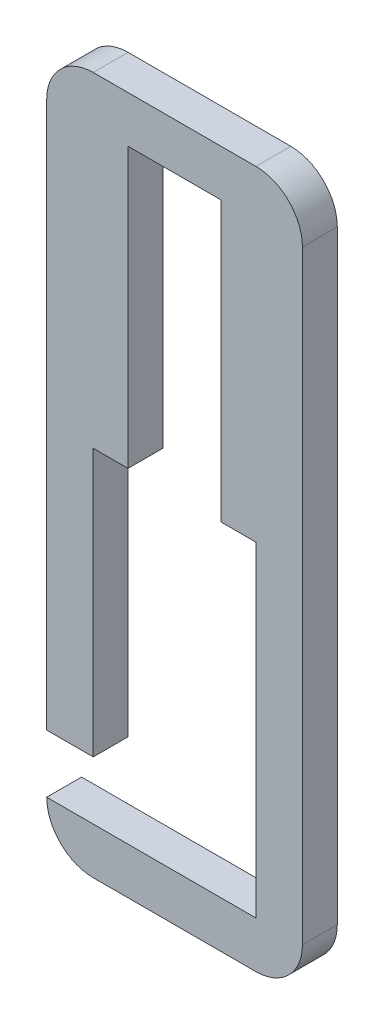
ISO-10303-21;
HEADER;
FILE_DESCRIPTION(('STEP AP214'),'2;1');
FILE_NAME('part.step','',(''),(''),'','','');
FILE_SCHEMA(('AUTOMOTIVE_DESIGN { 1 0 10303 214 1 1 1 1 }'));
ENDSEC;
DATA;
#1=APPLICATION_CONTEXT('core data for automotive mechanical design processes');
#2=APPLICATION_PROTOCOL_DEFINITION('international standard','automotive_design',2000,#1);
#3=PRODUCT_CONTEXT('',#1,'mechanical');
#4=PRODUCT('Part','Part','',(#3));
#5=PRODUCT_RELATED_PRODUCT_CATEGORY('part','',(#4));
#6=PRODUCT_DEFINITION_FORMATION('','',#4);
#7=PRODUCT_DEFINITION_CONTEXT('part definition',#1,'design');
#8=PRODUCT_DEFINITION('design','',#6,#7);
#9=PRODUCT_DEFINITION_SHAPE('','',#8);
#10=(LENGTH_UNIT() NAMED_UNIT(*) SI_UNIT(.MILLI.,.METRE.));
#11=(NAMED_UNIT(*) PLANE_ANGLE_UNIT() SI_UNIT($,.RADIAN.));
#12=(NAMED_UNIT(*) SI_UNIT($,.STERADIAN.) SOLID_ANGLE_UNIT());
#13=UNCERTAINTY_MEASURE_WITH_UNIT(LENGTH_MEASURE(1.E-05),#10,'distance_accuracy_value','');
#14=(GEOMETRIC_REPRESENTATION_CONTEXT(3) GLOBAL_UNCERTAINTY_ASSIGNED_CONTEXT((#13)) GLOBAL_UNIT_ASSIGNED_CONTEXT((#10,
#11,#12)) REPRESENTATION_CONTEXT('',''));
#15=CARTESIAN_POINT('',(0.,0.,0.));
#16=DIRECTION('',(0.,0.,1.));
#17=DIRECTION('',(1.,0.,0.));
#18=AXIS2_PLACEMENT_3D('',#15,#16,#17);
#19=CARTESIAN_POINT('',(0.,0.,3.));
#20=DIRECTION('',(0.,0.,1.));
#21=DIRECTION('',(1.,0.,0.));
#22=AXIS2_PLACEMENT_3D('',#19,#20,#21);
#23=PLANE('',#22);
#24=DIRECTION('',(1.,0.,0.));
#25=VECTOR('',#24,1.);
#26=CARTESIAN_POINT('',(7.,-26.,3.));
#27=LINE('',#26,#25);
#28=CARTESIAN_POINT('',(-11.,-26.,3.));
#29=VERTEX_POINT('',#28);
#30=CARTESIAN_POINT('',(7.,-26.,3.));
#31=VERTEX_POINT('',#30);
#32=EDGE_CURVE('E232',#29,#31,#27,.T.);
#33=ORIENTED_EDGE('',*,*,#32,.F.);
#34=CARTESIAN_POINT('',(-7.,-26.,3.));
#35=DIRECTION('',(0.,0.,1.));
#36=DIRECTION('',(1.,0.,0.));
#37=AXIS2_PLACEMENT_3D('',#34,#35,#36);
#38=CIRCLE('',#37,4.);
#39=CARTESIAN_POINT('',(-7.,-30.,3.));
#40=VERTEX_POINT('',#39);
#41=EDGE_CURVE('E304',#29,#40,#38,.T.);
#42=ORIENTED_EDGE('',*,*,#41,.T.);
#43=DIRECTION('',(1.,0.,0.));
#44=VECTOR('',#43,1.);
#45=CARTESIAN_POINT('',(11.,-30.,3.));
#46=LINE('',#45,#44);
#47=CARTESIAN_POINT('',(7.,-30.,3.));
#48=VERTEX_POINT('',#47);
#49=EDGE_CURVE('E255',#40,#48,#46,.T.);
#50=ORIENTED_EDGE('',*,*,#49,.T.);
#51=CARTESIAN_POINT('',(7.,-26.,3.));
#52=DIRECTION('',(0.,0.,1.));
#53=DIRECTION('',(1.,0.,0.));
#54=AXIS2_PLACEMENT_3D('',#51,#52,#53);
#55=CIRCLE('',#54,4.);
#56=CARTESIAN_POINT('',(11.,-26.,3.));
#57=VERTEX_POINT('',#56);
#58=EDGE_CURVE('E301',#48,#57,#55,.T.);
#59=ORIENTED_EDGE('',*,*,#58,.T.);
#60=DIRECTION('',(0.,1.,0.));
#61=VECTOR('',#60,1.);
#62=CARTESIAN_POINT('',(11.,-30.,3.));
#63=LINE('',#62,#61);
#64=CARTESIAN_POINT('',(11.,26.,3.));
#65=VERTEX_POINT('',#64);
#66=EDGE_CURVE('E260',#57,#65,#63,.T.);
#67=ORIENTED_EDGE('',*,*,#66,.T.);
#68=CARTESIAN_POINT('',(7.,26.,3.));
#69=DIRECTION('',(0.,0.,1.));
#70=DIRECTION('',(1.,0.,0.));
#71=AXIS2_PLACEMENT_3D('',#68,#69,#70);
#72=CIRCLE('',#71,4.);
#73=CARTESIAN_POINT('',(7.,30.,3.));
#74=VERTEX_POINT('',#73);
#75=EDGE_CURVE('E298',#65,#74,#72,.T.);
#76=ORIENTED_EDGE('',*,*,#75,.T.);
#77=DIRECTION('',(-1.,0.,0.));
#78=VECTOR('',#77,1.);
#79=CARTESIAN_POINT('',(11.,30.,3.));
#80=LINE('',#79,#78);
#81=CARTESIAN_POINT('',(-7.,30.,3.));
#82=VERTEX_POINT('',#81);
#83=EDGE_CURVE('E179',#74,#82,#80,.T.);
#84=ORIENTED_EDGE('',*,*,#83,.T.);
#85=CARTESIAN_POINT('',(-7.,26.,3.));
#86=DIRECTION('',(0.,0.,1.));
#87=DIRECTION('',(1.,0.,0.));
#88=AXIS2_PLACEMENT_3D('',#85,#86,#87);
#89=CIRCLE('',#88,4.);
#90=CARTESIAN_POINT('',(-11.,26.,3.));
#91=VERTEX_POINT('',#90);
#92=EDGE_CURVE('E59',#82,#91,#89,.T.);
#93=ORIENTED_EDGE('',*,*,#92,.T.);
#94=DIRECTION('',(0.,-1.,0.));
#95=VECTOR('',#94,1.);
#96=CARTESIAN_POINT('',(-11.,-30.,3.));
#97=LINE('',#96,#95);
#98=CARTESIAN_POINT('',(-11.,-21.,3.));
#99=VERTEX_POINT('',#98);
#100=EDGE_CURVE('E184',#91,#99,#97,.T.);
#101=ORIENTED_EDGE('',*,*,#100,.T.);
#102=DIRECTION('',(-1.,0.,0.));
#103=VECTOR('',#102,1.);
#104=CARTESIAN_POINT('',(-11.,-21.,3.));
#105=LINE('',#104,#103);
#106=CARTESIAN_POINT('',(-7.,-21.,3.));
#107=VERTEX_POINT('',#106);
#108=EDGE_CURVE('E169',#107,#99,#105,.T.);
#109=ORIENTED_EDGE('',*,*,#108,.F.);
#110=DIRECTION('',(0.,-1.,0.));
#111=VECTOR('',#110,1.);
#112=CARTESIAN_POINT('',(-7.,-26.,3.));
#113=LINE('',#112,#111);
#114=CARTESIAN_POINT('',(-7.,1.99999999999999,3.));
#115=VERTEX_POINT('',#114);
#116=EDGE_CURVE('E183',#115,#107,#113,.T.);
#117=ORIENTED_EDGE('',*,*,#116,.F.);
#118=DIRECTION('',(-1.,0.,0.));
#119=VECTOR('',#118,1.);
#120=CARTESIAN_POINT('',(-4.,1.99999999999999,3.));
#121=LINE('',#120,#119);
#122=CARTESIAN_POINT('',(-4.,1.99999999999999,3.));
#123=VERTEX_POINT('',#122);
#124=EDGE_CURVE('E192',#123,#115,#121,.T.);
#125=ORIENTED_EDGE('',*,*,#124,.F.);
#126=DIRECTION('',(0.,-1.,0.));
#127=VECTOR('',#126,1.);
#128=CARTESIAN_POINT('',(-4.,1.99999999999999,3.));
#129=LINE('',#128,#127);
#130=CARTESIAN_POINT('',(-4.,26.,3.));
#131=VERTEX_POINT('',#130);
#132=EDGE_CURVE('E198',#131,#123,#129,.T.);
#133=ORIENTED_EDGE('',*,*,#132,.F.);
#134=DIRECTION('',(-1.,0.,0.));
#135=VECTOR('',#134,1.);
#136=CARTESIAN_POINT('',(4.,26.,3.));
#137=LINE('',#136,#135);
#138=CARTESIAN_POINT('',(4.,26.,3.));
#139=VERTEX_POINT('',#138);
#140=EDGE_CURVE('E351',#139,#131,#137,.T.);
#141=ORIENTED_EDGE('',*,*,#140,.F.);
#142=DIRECTION('',(0.,1.,0.));
#143=VECTOR('',#142,1.);
#144=CARTESIAN_POINT('',(4.,26.,3.));
#145=LINE('',#144,#143);
#146=CARTESIAN_POINT('',(4.,1.99999999999999,3.));
#147=VERTEX_POINT('',#146);
#148=EDGE_CURVE('E348',#147,#139,#145,.T.);
#149=ORIENTED_EDGE('',*,*,#148,.F.);
#150=DIRECTION('',(-1.,0.,0.));
#151=VECTOR('',#150,1.);
#152=CARTESIAN_POINT('',(4.,1.99999999999999,3.));
#153=LINE('',#152,#151);
#154=CARTESIAN_POINT('',(7.,1.99999999999999,3.));
#155=VERTEX_POINT('',#154);
#156=EDGE_CURVE('E345',#155,#147,#153,.T.);
#157=ORIENTED_EDGE('',*,*,#156,.F.);
#158=DIRECTION('',(0.,1.,0.));
#159=VECTOR('',#158,1.);
#160=CARTESIAN_POINT('',(7.,-26.,3.));
#161=LINE('',#160,#159);
#162=EDGE_CURVE('E342',#31,#155,#161,.T.);
#163=ORIENTED_EDGE('',*,*,#162,.F.);
#164=EDGE_LOOP('',(#33,#42,#50,#59,#67,#76,#84,#93,#101,#109,#117,#125,#133,#141,#149,#157,#163));
#165=FACE_BOUND('',#164,.T.);
#166=ADVANCED_FACE('F43',(#165),#23,.T.);
#167=CARTESIAN_POINT('',(0.,0.,0.));
#168=DIRECTION('',(0.,0.,1.));
#169=DIRECTION('',(1.,0.,0.));
#170=AXIS2_PLACEMENT_3D('',#167,#168,#169);
#171=PLANE('',#170);
#172=DIRECTION('',(1.,0.,0.));
#173=VECTOR('',#172,1.);
#174=CARTESIAN_POINT('',(11.,-30.,0.));
#175=LINE('',#174,#173);
#176=CARTESIAN_POINT('',(-7.,-30.,0.));
#177=VERTEX_POINT('',#176);
#178=CARTESIAN_POINT('',(7.,-30.,0.));
#179=VERTEX_POINT('',#178);
#180=EDGE_CURVE('E268',#177,#179,#175,.T.);
#181=ORIENTED_EDGE('',*,*,#180,.F.);
#182=CARTESIAN_POINT('',(-7.,-26.,0.));
#183=DIRECTION('',(0.,0.,1.));
#184=DIRECTION('',(1.,0.,0.));
#185=AXIS2_PLACEMENT_3D('',#182,#183,#184);
#186=CIRCLE('',#185,4.);
#187=CARTESIAN_POINT('',(-11.,-26.,0.));
#188=VERTEX_POINT('',#187);
#189=EDGE_CURVE('E293',#177,#188,#186,.F.);
#190=ORIENTED_EDGE('',*,*,#189,.T.);
#191=DIRECTION('',(1.,0.,0.));
#192=VECTOR('',#191,1.);
#193=CARTESIAN_POINT('',(7.,-26.,0.));
#194=LINE('',#193,#192);
#195=CARTESIAN_POINT('',(7.,-26.,0.));
#196=VERTEX_POINT('',#195);
#197=EDGE_CURVE('E202',#188,#196,#194,.T.);
#198=ORIENTED_EDGE('',*,*,#197,.T.);
#199=DIRECTION('',(0.,1.,0.));
#200=VECTOR('',#199,1.);
#201=CARTESIAN_POINT('',(7.,-26.,0.));
#202=LINE('',#201,#200);
#203=CARTESIAN_POINT('',(7.,1.99999999999999,0.));
#204=VERTEX_POINT('',#203);
#205=EDGE_CURVE('E206',#196,#204,#202,.T.);
#206=ORIENTED_EDGE('',*,*,#205,.T.);
#207=DIRECTION('',(-1.,0.,0.));
#208=VECTOR('',#207,1.);
#209=CARTESIAN_POINT('',(4.,1.99999999999999,0.));
#210=LINE('',#209,#208);
#211=CARTESIAN_POINT('',(4.,1.99999999999999,0.));
#212=VERTEX_POINT('',#211);
#213=EDGE_CURVE('E210',#204,#212,#210,.T.);
#214=ORIENTED_EDGE('',*,*,#213,.T.);
#215=DIRECTION('',(0.,1.,0.));
#216=VECTOR('',#215,1.);
#217=CARTESIAN_POINT('',(4.,26.,0.));
#218=LINE('',#217,#216);
#219=CARTESIAN_POINT('',(4.,26.,0.));
#220=VERTEX_POINT('',#219);
#221=EDGE_CURVE('E214',#212,#220,#218,.T.);
#222=ORIENTED_EDGE('',*,*,#221,.T.);
#223=DIRECTION('',(-1.,0.,0.));
#224=VECTOR('',#223,1.);
#225=CARTESIAN_POINT('',(4.,26.,0.));
#226=LINE('',#225,#224);
#227=CARTESIAN_POINT('',(-4.,26.,0.));
#228=VERTEX_POINT('',#227);
#229=EDGE_CURVE('E218',#220,#228,#226,.T.);
#230=ORIENTED_EDGE('',*,*,#229,.T.);
#231=DIRECTION('',(0.,-1.,0.));
#232=VECTOR('',#231,1.);
#233=CARTESIAN_POINT('',(-4.,1.99999999999999,0.));
#234=LINE('',#233,#232);
#235=CARTESIAN_POINT('',(-4.,1.99999999999999,0.));
#236=VERTEX_POINT('',#235);
#237=EDGE_CURVE('E222',#228,#236,#234,.T.);
#238=ORIENTED_EDGE('',*,*,#237,.T.);
#239=DIRECTION('',(-1.,0.,0.));
#240=VECTOR('',#239,1.);
#241=CARTESIAN_POINT('',(-4.,1.99999999999999,0.));
#242=LINE('',#241,#240);
#243=CARTESIAN_POINT('',(-7.,1.99999999999999,0.));
#244=VERTEX_POINT('',#243);
#245=EDGE_CURVE('E226',#236,#244,#242,.T.);
#246=ORIENTED_EDGE('',*,*,#245,.T.);
#247=DIRECTION('',(0.,-1.,0.));
#248=VECTOR('',#247,1.);
#249=CARTESIAN_POINT('',(-7.,-26.,0.));
#250=LINE('',#249,#248);
#251=CARTESIAN_POINT('',(-7.,-21.,0.));
#252=VERTEX_POINT('',#251);
#253=EDGE_CURVE('E230',#244,#252,#250,.T.);
#254=ORIENTED_EDGE('',*,*,#253,.T.);
#255=DIRECTION('',(-1.,0.,0.));
#256=VECTOR('',#255,1.);
#257=CARTESIAN_POINT('',(0.,-21.,0.));
#258=LINE('',#257,#256);
#259=CARTESIAN_POINT('',(-11.,-21.,0.));
#260=VERTEX_POINT('',#259);
#261=EDGE_CURVE('E172',#252,#260,#258,.T.);
#262=ORIENTED_EDGE('',*,*,#261,.T.);
#263=DIRECTION('',(0.,-1.,0.));
#264=VECTOR('',#263,1.);
#265=CARTESIAN_POINT('',(-11.,-30.,0.));
#266=LINE('',#265,#264);
#267=CARTESIAN_POINT('',(-11.,26.,0.));
#268=VERTEX_POINT('',#267);
#269=EDGE_CURVE('E252',#268,#260,#266,.T.);
#270=ORIENTED_EDGE('',*,*,#269,.F.);
#271=CARTESIAN_POINT('',(-7.,26.,0.));
#272=DIRECTION('',(0.,0.,1.));
#273=DIRECTION('',(1.,0.,0.));
#274=AXIS2_PLACEMENT_3D('',#271,#272,#273);
#275=CIRCLE('',#274,4.);
#276=CARTESIAN_POINT('',(-7.,30.,0.));
#277=VERTEX_POINT('',#276);
#278=EDGE_CURVE('E284',#268,#277,#275,.F.);
#279=ORIENTED_EDGE('',*,*,#278,.T.);
#280=DIRECTION('',(-1.,0.,0.));
#281=VECTOR('',#280,1.);
#282=CARTESIAN_POINT('',(11.,30.,0.));
#283=LINE('',#282,#281);
#284=CARTESIAN_POINT('',(7.,30.,0.));
#285=VERTEX_POINT('',#284);
#286=EDGE_CURVE('E256',#285,#277,#283,.T.);
#287=ORIENTED_EDGE('',*,*,#286,.F.);
#288=CARTESIAN_POINT('',(7.,26.,0.));
#289=DIRECTION('',(0.,0.,1.));
#290=DIRECTION('',(1.,0.,0.));
#291=AXIS2_PLACEMENT_3D('',#288,#289,#290);
#292=CIRCLE('',#291,4.);
#293=CARTESIAN_POINT('',(11.,26.,0.));
#294=VERTEX_POINT('',#293);
#295=EDGE_CURVE('E287',#285,#294,#292,.F.);
#296=ORIENTED_EDGE('',*,*,#295,.T.);
#297=DIRECTION('',(0.,1.,0.));
#298=VECTOR('',#297,1.);
#299=CARTESIAN_POINT('',(11.,-30.,0.));
#300=LINE('',#299,#298);
#301=CARTESIAN_POINT('',(11.,-26.,0.));
#302=VERTEX_POINT('',#301);
#303=EDGE_CURVE('E272',#302,#294,#300,.T.);
#304=ORIENTED_EDGE('',*,*,#303,.F.);
#305=CARTESIAN_POINT('',(7.,-26.,0.));
#306=DIRECTION('',(0.,0.,1.));
#307=DIRECTION('',(1.,0.,0.));
#308=AXIS2_PLACEMENT_3D('',#305,#306,#307);
#309=CIRCLE('',#308,4.);
#310=EDGE_CURVE('E290',#302,#179,#309,.F.);
#311=ORIENTED_EDGE('',*,*,#310,.T.);
#312=EDGE_LOOP('',(#181,#190,#198,#206,#214,#222,#230,#238,#246,#254,#262,#270,#279,#287,#296,
#304,#311));
#313=FACE_BOUND('',#312,.T.);
#314=ADVANCED_FACE('F324',(#313),#171,.F.);
#315=CARTESIAN_POINT('',(-11.,-30.,3.));
#316=DIRECTION('',(1.,0.,0.));
#317=DIRECTION('',(0.,0.,-1.));
#318=AXIS2_PLACEMENT_3D('',#315,#316,#317);
#319=PLANE('',#318);
#320=ORIENTED_EDGE('',*,*,#100,.F.);
#321=DIRECTION('',(0.,0.,-1.));
#322=VECTOR('',#321,1.);
#323=CARTESIAN_POINT('',(-11.,26.,3.));
#324=LINE('',#323,#322);
#325=EDGE_CURVE('E11',#91,#268,#324,.T.);
#326=ORIENTED_EDGE('',*,*,#325,.T.);
#327=ORIENTED_EDGE('',*,*,#269,.T.);
#328=DIRECTION('',(0.,0.,1.));
#329=VECTOR('',#328,1.);
#330=CARTESIAN_POINT('',(-11.,-21.,-2.));
#331=LINE('',#330,#329);
#332=EDGE_CURVE('E186',#260,#99,#331,.T.);
#333=ORIENTED_EDGE('',*,*,#332,.T.);
#334=EDGE_LOOP('',(#320,#326,#327,#333));
#335=FACE_BOUND('',#334,.T.);
#336=ADVANCED_FACE('F330',(#335),#319,.F.);
#337=CARTESIAN_POINT('',(11.,-30.,3.));
#338=DIRECTION('',(0.,1.,0.));
#339=DIRECTION('',(-1.,0.,0.));
#340=AXIS2_PLACEMENT_3D('',#337,#338,#339);
#341=PLANE('',#340);
#342=ORIENTED_EDGE('',*,*,#49,.F.);
#343=DIRECTION('',(0.,0.,-1.));
#344=VECTOR('',#343,1.);
#345=CARTESIAN_POINT('',(-7.,-30.,3.));
#346=LINE('',#345,#344);
#347=EDGE_CURVE('E280',#40,#177,#346,.T.);
#348=ORIENTED_EDGE('',*,*,#347,.T.);
#349=ORIENTED_EDGE('',*,*,#180,.T.);
#350=DIRECTION('',(0.,0.,-1.));
#351=VECTOR('',#350,1.);
#352=CARTESIAN_POINT('',(7.,-30.,3.));
#353=LINE('',#352,#351);
#354=EDGE_CURVE('E178',#179,#48,#353,.F.);
#355=ORIENTED_EDGE('',*,*,#354,.T.);
#356=EDGE_LOOP('',(#342,#348,#349,#355));
#357=FACE_BOUND('',#356,.T.);
#358=ADVANCED_FACE('F392',(#357),#341,.F.);
#359=CARTESIAN_POINT('',(11.,-30.,3.));
#360=DIRECTION('',(-1.,0.,0.));
#361=DIRECTION('',(0.,0.,1.));
#362=AXIS2_PLACEMENT_3D('',#359,#360,#361);
#363=PLANE('',#362);
#364=ORIENTED_EDGE('',*,*,#66,.F.);
#365=DIRECTION('',(0.,0.,-1.));
#366=VECTOR('',#365,1.);
#367=CARTESIAN_POINT('',(11.,-26.,3.));
#368=LINE('',#367,#366);
#369=EDGE_CURVE('E310',#57,#302,#368,.T.);
#370=ORIENTED_EDGE('',*,*,#369,.T.);
#371=ORIENTED_EDGE('',*,*,#303,.T.);
#372=DIRECTION('',(0.,0.,-1.));
#373=VECTOR('',#372,1.);
#374=CARTESIAN_POINT('',(11.,26.,3.));
#375=LINE('',#374,#373);
#376=EDGE_CURVE('E307',#294,#65,#375,.F.);
#377=ORIENTED_EDGE('',*,*,#376,.T.);
#378=EDGE_LOOP('',(#364,#370,#371,#377));
#379=FACE_BOUND('',#378,.T.);
#380=ADVANCED_FACE('F400',(#379),#363,.F.);
#381=CARTESIAN_POINT('',(11.,30.,3.));
#382=DIRECTION('',(0.,-1.,0.));
#383=DIRECTION('',(0.,0.,-1.));
#384=AXIS2_PLACEMENT_3D('',#381,#382,#383);
#385=PLANE('',#384);
#386=ORIENTED_EDGE('',*,*,#83,.F.);
#387=DIRECTION('',(0.,0.,-1.));
#388=VECTOR('',#387,1.);
#389=CARTESIAN_POINT('',(7.,30.,3.));
#390=LINE('',#389,#388);
#391=EDGE_CURVE('E52',#74,#285,#390,.T.);
#392=ORIENTED_EDGE('',*,*,#391,.T.);
#393=ORIENTED_EDGE('',*,*,#286,.T.);
#394=DIRECTION('',(0.,0.,-1.));
#395=VECTOR('',#394,1.);
#396=CARTESIAN_POINT('',(-7.,30.,3.));
#397=LINE('',#396,#395);
#398=EDGE_CURVE('E67',#277,#82,#397,.F.);
#399=ORIENTED_EDGE('',*,*,#398,.T.);
#400=EDGE_LOOP('',(#386,#392,#393,#399));
#401=FACE_BOUND('',#400,.T.);
#402=ADVANCED_FACE('F319',(#401),#385,.F.);
#403=CARTESIAN_POINT('',(7.,-26.,3.));
#404=DIRECTION('',(0.,1.,0.));
#405=DIRECTION('',(0.,0.,1.));
#406=AXIS2_PLACEMENT_3D('',#403,#404,#405);
#407=PLANE('',#406);
#408=ORIENTED_EDGE('',*,*,#197,.F.);
#409=DIRECTION('',(0.,0.,1.));
#410=VECTOR('',#409,1.);
#411=CARTESIAN_POINT('',(-11.,-26.,-2.));
#412=LINE('',#411,#410);
#413=EDGE_CURVE('E332',#188,#29,#412,.T.);
#414=ORIENTED_EDGE('',*,*,#413,.T.);
#415=ORIENTED_EDGE('',*,*,#32,.T.);
#416=DIRECTION('',(0.,0.,-1.));
#417=VECTOR('',#416,1.);
#418=CARTESIAN_POINT('',(7.,-26.,3.));
#419=LINE('',#418,#417);
#420=EDGE_CURVE('E248',#31,#196,#419,.T.);
#421=ORIENTED_EDGE('',*,*,#420,.T.);
#422=EDGE_LOOP('',(#408,#414,#415,#421));
#423=FACE_BOUND('',#422,.T.);
#424=ADVANCED_FACE('F387',(#423),#407,.T.);
#425=CARTESIAN_POINT('',(7.,-26.,3.));
#426=DIRECTION('',(-1.,0.,0.));
#427=DIRECTION('',(0.,0.,1.));
#428=AXIS2_PLACEMENT_3D('',#425,#426,#427);
#429=PLANE('',#428);
#430=ORIENTED_EDGE('',*,*,#205,.F.);
#431=ORIENTED_EDGE('',*,*,#420,.F.);
#432=ORIENTED_EDGE('',*,*,#162,.T.);
#433=DIRECTION('',(0.,0.,-1.));
#434=VECTOR('',#433,1.);
#435=CARTESIAN_POINT('',(7.,1.99999999999999,3.));
#436=LINE('',#435,#434);
#437=EDGE_CURVE('E245',#155,#204,#436,.T.);
#438=ORIENTED_EDGE('',*,*,#437,.T.);
#439=EDGE_LOOP('',(#430,#431,#432,#438));
#440=FACE_BOUND('',#439,.T.);
#441=ADVANCED_FACE('F380',(#440),#429,.T.);
#442=CARTESIAN_POINT('',(4.,1.99999999999999,3.));
#443=DIRECTION('',(0.,-1.,0.));
#444=DIRECTION('',(0.,0.,-1.));
#445=AXIS2_PLACEMENT_3D('',#442,#443,#444);
#446=PLANE('',#445);
#447=ORIENTED_EDGE('',*,*,#213,.F.);
#448=ORIENTED_EDGE('',*,*,#437,.F.);
#449=ORIENTED_EDGE('',*,*,#156,.T.);
#450=DIRECTION('',(0.,0.,-1.));
#451=VECTOR('',#450,1.);
#452=CARTESIAN_POINT('',(4.,1.99999999999999,3.));
#453=LINE('',#452,#451);
#454=EDGE_CURVE('E242',#147,#212,#453,.T.);
#455=ORIENTED_EDGE('',*,*,#454,.T.);
#456=EDGE_LOOP('',(#447,#448,#449,#455));
#457=FACE_BOUND('',#456,.T.);
#458=ADVANCED_FACE('F377',(#457),#446,.T.);
#459=CARTESIAN_POINT('',(4.,26.,3.));
#460=DIRECTION('',(-1.,0.,0.));
#461=DIRECTION('',(0.,-1.,0.));
#462=AXIS2_PLACEMENT_3D('',#459,#460,#461);
#463=PLANE('',#462);
#464=ORIENTED_EDGE('',*,*,#221,.F.);
#465=ORIENTED_EDGE('',*,*,#454,.F.);
#466=ORIENTED_EDGE('',*,*,#148,.T.);
#467=DIRECTION('',(0.,0.,-1.));
#468=VECTOR('',#467,1.);
#469=CARTESIAN_POINT('',(4.,26.,3.));
#470=LINE('',#469,#468);
#471=EDGE_CURVE('E239',#139,#220,#470,.T.);
#472=ORIENTED_EDGE('',*,*,#471,.T.);
#473=EDGE_LOOP('',(#464,#465,#466,#472));
#474=FACE_BOUND('',#473,.T.);
#475=ADVANCED_FACE('F374',(#474),#463,.T.);
#476=CARTESIAN_POINT('',(4.,26.,3.));
#477=DIRECTION('',(0.,-1.,0.));
#478=DIRECTION('',(0.,0.,-1.));
#479=AXIS2_PLACEMENT_3D('',#476,#477,#478);
#480=PLANE('',#479);
#481=ORIENTED_EDGE('',*,*,#229,.F.);
#482=ORIENTED_EDGE('',*,*,#471,.F.);
#483=ORIENTED_EDGE('',*,*,#140,.T.);
#484=DIRECTION('',(0.,0.,-1.));
#485=VECTOR('',#484,1.);
#486=CARTESIAN_POINT('',(-4.,26.,3.));
#487=LINE('',#486,#485);
#488=EDGE_CURVE('E236',#131,#228,#487,.T.);
#489=ORIENTED_EDGE('',*,*,#488,.T.);
#490=EDGE_LOOP('',(#481,#482,#483,#489));
#491=FACE_BOUND('',#490,.T.);
#492=ADVANCED_FACE('F368',(#491),#480,.T.);
#493=CARTESIAN_POINT('',(-4.,1.99999999999999,3.));
#494=DIRECTION('',(1.,0.,0.));
#495=DIRECTION('',(0.,1.,0.));
#496=AXIS2_PLACEMENT_3D('',#493,#494,#495);
#497=PLANE('',#496);
#498=ORIENTED_EDGE('',*,*,#237,.F.);
#499=ORIENTED_EDGE('',*,*,#488,.F.);
#500=ORIENTED_EDGE('',*,*,#132,.T.);
#501=DIRECTION('',(0.,0.,-1.));
#502=VECTOR('',#501,1.);
#503=CARTESIAN_POINT('',(-4.,1.99999999999999,3.));
#504=LINE('',#503,#502);
#505=EDGE_CURVE('E196',#123,#236,#504,.T.);
#506=ORIENTED_EDGE('',*,*,#505,.T.);
#507=EDGE_LOOP('',(#498,#499,#500,#506));
#508=FACE_BOUND('',#507,.T.);
#509=ADVANCED_FACE('F359',(#508),#497,.T.);
#510=CARTESIAN_POINT('',(-4.,1.99999999999999,3.));
#511=DIRECTION('',(0.,-1.,0.));
#512=DIRECTION('',(1.,0.,0.));
#513=AXIS2_PLACEMENT_3D('',#510,#511,#512);
#514=PLANE('',#513);
#515=ORIENTED_EDGE('',*,*,#245,.F.);
#516=ORIENTED_EDGE('',*,*,#505,.F.);
#517=ORIENTED_EDGE('',*,*,#124,.T.);
#518=DIRECTION('',(0.,0.,-1.));
#519=VECTOR('',#518,1.);
#520=CARTESIAN_POINT('',(-7.,1.99999999999999,3.));
#521=LINE('',#520,#519);
#522=EDGE_CURVE('E189',#115,#244,#521,.T.);
#523=ORIENTED_EDGE('',*,*,#522,.T.);
#524=EDGE_LOOP('',(#515,#516,#517,#523));
#525=FACE_BOUND('',#524,.T.);
#526=ADVANCED_FACE('F363',(#525),#514,.T.);
#527=CARTESIAN_POINT('',(-7.,-26.,3.));
#528=DIRECTION('',(1.,0.,0.));
#529=DIRECTION('',(0.,1.,0.));
#530=AXIS2_PLACEMENT_3D('',#527,#528,#529);
#531=PLANE('',#530);
#532=DIRECTION('',(0.,0.,1.));
#533=VECTOR('',#532,1.);
#534=CARTESIAN_POINT('',(-7.,-21.,3.));
#535=LINE('',#534,#533);
#536=EDGE_CURVE('E165',#252,#107,#535,.T.);
#537=ORIENTED_EDGE('',*,*,#536,.F.);
#538=ORIENTED_EDGE('',*,*,#253,.F.);
#539=ORIENTED_EDGE('',*,*,#522,.F.);
#540=ORIENTED_EDGE('',*,*,#116,.T.);
#541=EDGE_LOOP('',(#537,#538,#539,#540));
#542=FACE_BOUND('',#541,.T.);
#543=ADVANCED_FACE('F188',(#542),#531,.T.);
#544=CARTESIAN_POINT('',(-11.,-21.,-2.));
#545=DIRECTION('',(0.,1.,0.));
#546=DIRECTION('',(0.,0.,1.));
#547=AXIS2_PLACEMENT_3D('',#544,#545,#546);
#548=PLANE('',#547);
#549=ORIENTED_EDGE('',*,*,#536,.T.);
#550=ORIENTED_EDGE('',*,*,#108,.T.);
#551=ORIENTED_EDGE('',*,*,#332,.F.);
#552=ORIENTED_EDGE('',*,*,#261,.F.);
#553=EDGE_LOOP('',(#549,#550,#551,#552));
#554=FACE_BOUND('',#553,.T.);
#555=ADVANCED_FACE('F167',(#554),#548,.F.);
#556=CARTESIAN_POINT('',(-7.,-26.,3.));
#557=DIRECTION('',(0.,0.,-1.));
#558=DIRECTION('',(-1.,0.,0.));
#559=AXIS2_PLACEMENT_3D('',#556,#557,#558);
#560=CYLINDRICAL_SURFACE('',#559,4.);
#561=ORIENTED_EDGE('',*,*,#41,.F.);
#562=ORIENTED_EDGE('',*,*,#413,.F.);
#563=ORIENTED_EDGE('',*,*,#189,.F.);
#564=ORIENTED_EDGE('',*,*,#347,.F.);
#565=EDGE_LOOP('',(#561,#562,#563,#564));
#566=FACE_BOUND('',#565,.T.);
#567=ADVANCED_FACE('F390',(#566),#560,.T.);
#568=CARTESIAN_POINT('',(7.,-26.,3.));
#569=DIRECTION('',(0.,0.,-1.));
#570=DIRECTION('',(-1.,0.,0.));
#571=AXIS2_PLACEMENT_3D('',#568,#569,#570);
#572=CYLINDRICAL_SURFACE('',#571,4.);
#573=ORIENTED_EDGE('',*,*,#58,.F.);
#574=ORIENTED_EDGE('',*,*,#354,.F.);
#575=ORIENTED_EDGE('',*,*,#310,.F.);
#576=ORIENTED_EDGE('',*,*,#369,.F.);
#577=EDGE_LOOP('',(#573,#574,#575,#576));
#578=FACE_BOUND('',#577,.T.);
#579=ADVANCED_FACE('F397',(#578),#572,.T.);
#580=CARTESIAN_POINT('',(7.,26.,3.));
#581=DIRECTION('',(0.,0.,-1.));
#582=DIRECTION('',(-1.,0.,0.));
#583=AXIS2_PLACEMENT_3D('',#580,#581,#582);
#584=CYLINDRICAL_SURFACE('',#583,4.);
#585=ORIENTED_EDGE('',*,*,#75,.F.);
#586=ORIENTED_EDGE('',*,*,#376,.F.);
#587=ORIENTED_EDGE('',*,*,#295,.F.);
#588=ORIENTED_EDGE('',*,*,#391,.F.);
#589=EDGE_LOOP('',(#585,#586,#587,#588));
#590=FACE_BOUND('',#589,.T.);
#591=ADVANCED_FACE('F402',(#590),#584,.T.);
#592=CARTESIAN_POINT('',(-7.,26.,3.));
#593=DIRECTION('',(0.,0.,-1.));
#594=DIRECTION('',(-1.,0.,0.));
#595=AXIS2_PLACEMENT_3D('',#592,#593,#594);
#596=CYLINDRICAL_SURFACE('',#595,4.);
#597=ORIENTED_EDGE('',*,*,#92,.F.);
#598=ORIENTED_EDGE('',*,*,#398,.F.);
#599=ORIENTED_EDGE('',*,*,#278,.F.);
#600=ORIENTED_EDGE('',*,*,#325,.F.);
#601=EDGE_LOOP('',(#597,#598,#599,#600));
#602=FACE_BOUND('',#601,.T.);
#603=ADVANCED_FACE('F45',(#602),#596,.T.);
#604=CLOSED_SHELL('',(#166,#314,#336,#358,#380,#402,#424,#441,#458,#475,#492,#509,#526,#543,
#555,#567,#579,#591,#603));
#605=MANIFOLD_SOLID_BREP('B2',#604);
#606=ADVANCED_BREP_SHAPE_REPRESENTATION('',(#18,#605),#14);
#607=SHAPE_DEFINITION_REPRESENTATION(#9,#606);
ENDSEC;
END-ISO-10303-21;
